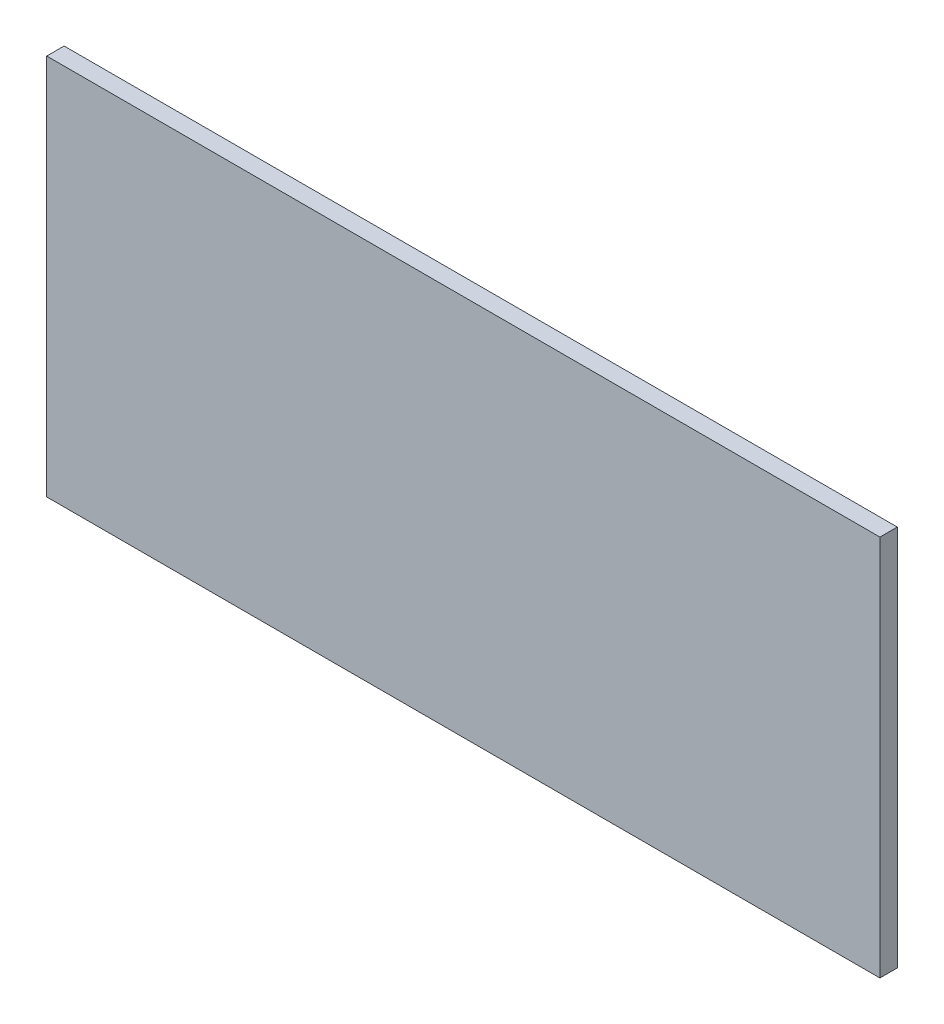
ISO-10303-21;
HEADER;
FILE_DESCRIPTION(('STEP AP214'),'2;1');
FILE_NAME('part.step','',(''),(''),'','','');
FILE_SCHEMA(('AUTOMOTIVE_DESIGN { 1 0 10303 214 1 1 1 1 }'));
ENDSEC;
DATA;
#1=APPLICATION_CONTEXT('core data for automotive mechanical design processes');
#2=APPLICATION_PROTOCOL_DEFINITION('international standard','automotive_design',2000,#1);
#3=PRODUCT_CONTEXT('',#1,'mechanical');
#4=PRODUCT('Part','Part','',(#3));
#5=PRODUCT_RELATED_PRODUCT_CATEGORY('part','',(#4));
#6=PRODUCT_DEFINITION_FORMATION('','',#4);
#7=PRODUCT_DEFINITION_CONTEXT('part definition',#1,'design');
#8=PRODUCT_DEFINITION('design','',#6,#7);
#9=PRODUCT_DEFINITION_SHAPE('','',#8);
#10=(LENGTH_UNIT() NAMED_UNIT(*) SI_UNIT(.MILLI.,.METRE.));
#11=(NAMED_UNIT(*) PLANE_ANGLE_UNIT() SI_UNIT($,.RADIAN.));
#12=(NAMED_UNIT(*) SI_UNIT($,.STERADIAN.) SOLID_ANGLE_UNIT());
#13=UNCERTAINTY_MEASURE_WITH_UNIT(LENGTH_MEASURE(1.E-05),#10,'distance_accuracy_value','');
#14=(GEOMETRIC_REPRESENTATION_CONTEXT(3) GLOBAL_UNCERTAINTY_ASSIGNED_CONTEXT((#13)) GLOBAL_UNIT_ASSIGNED_CONTEXT((#10,
#11,#12)) REPRESENTATION_CONTEXT('',''));
#15=CARTESIAN_POINT('',(0.,0.,0.));
#16=DIRECTION('',(0.,0.,1.));
#17=DIRECTION('',(1.,0.,0.));
#18=AXIS2_PLACEMENT_3D('',#15,#16,#17);
#19=CARTESIAN_POINT('',(0.,0.,6.35));
#20=DIRECTION('',(1.,0.,0.));
#21=DIRECTION('',(0.,0.,-1.));
#22=AXIS2_PLACEMENT_3D('',#19,#20,#21);
#23=PLANE('',#22);
#24=DIRECTION('',(0.,-1.,0.));
#25=VECTOR('',#24,1.);
#26=CARTESIAN_POINT('',(0.,0.,0.));
#27=LINE('',#26,#25);
#28=CARTESIAN_POINT('',(0.,139.7,0.));
#29=VERTEX_POINT('',#28);
#30=CARTESIAN_POINT('',(0.,0.,0.));
#31=VERTEX_POINT('',#30);
#32=EDGE_CURVE('E107',#29,#31,#27,.T.);
#33=ORIENTED_EDGE('',*,*,#32,.T.);
#34=DIRECTION('',(0.,0.,-1.));
#35=VECTOR('',#34,1.);
#36=CARTESIAN_POINT('',(0.,0.,6.35));
#37=LINE('',#36,#35);
#38=CARTESIAN_POINT('',(0.,0.,6.35));
#39=VERTEX_POINT('',#38);
#40=EDGE_CURVE('E11',#39,#31,#37,.T.);
#41=ORIENTED_EDGE('',*,*,#40,.F.);
#42=DIRECTION('',(0.,-1.,0.));
#43=VECTOR('',#42,1.);
#44=CARTESIAN_POINT('',(0.,0.,6.35));
#45=LINE('',#44,#43);
#46=CARTESIAN_POINT('',(0.,139.7,6.35));
#47=VERTEX_POINT('',#46);
#48=EDGE_CURVE('E91',#47,#39,#45,.T.);
#49=ORIENTED_EDGE('',*,*,#48,.F.);
#50=DIRECTION('',(0.,0.,-1.));
#51=VECTOR('',#50,1.);
#52=CARTESIAN_POINT('',(0.,139.7,6.35));
#53=LINE('',#52,#51);
#54=EDGE_CURVE('E103',#47,#29,#53,.T.);
#55=ORIENTED_EDGE('',*,*,#54,.T.);
#56=EDGE_LOOP('',(#33,#41,#49,#55));
#57=FACE_BOUND('',#56,.T.);
#58=ADVANCED_FACE('F39',(#57),#23,.F.);
#59=CARTESIAN_POINT('',(0.,0.,6.35));
#60=DIRECTION('',(0.,1.,0.));
#61=DIRECTION('',(0.,0.,1.));
#62=AXIS2_PLACEMENT_3D('',#59,#60,#61);
#63=PLANE('',#62);
#64=DIRECTION('',(1.,0.,0.));
#65=VECTOR('',#64,1.);
#66=CARTESIAN_POINT('',(0.,0.,0.));
#67=LINE('',#66,#65);
#68=CARTESIAN_POINT('',(304.8,0.,0.));
#69=VERTEX_POINT('',#68);
#70=EDGE_CURVE('E96',#31,#69,#67,.T.);
#71=ORIENTED_EDGE('',*,*,#70,.T.);
#72=DIRECTION('',(0.,0.,-1.));
#73=VECTOR('',#72,1.);
#74=CARTESIAN_POINT('',(304.8,0.,6.35));
#75=LINE('',#74,#73);
#76=CARTESIAN_POINT('',(304.8,0.,6.35));
#77=VERTEX_POINT('',#76);
#78=EDGE_CURVE('E48',#77,#69,#75,.T.);
#79=ORIENTED_EDGE('',*,*,#78,.F.);
#80=DIRECTION('',(1.,0.,0.));
#81=VECTOR('',#80,1.);
#82=CARTESIAN_POINT('',(0.,0.,6.35));
#83=LINE('',#82,#81);
#84=EDGE_CURVE('E86',#39,#77,#83,.T.);
#85=ORIENTED_EDGE('',*,*,#84,.F.);
#86=ORIENTED_EDGE('',*,*,#40,.T.);
#87=EDGE_LOOP('',(#71,#79,#85,#86));
#88=FACE_BOUND('',#87,.T.);
#89=ADVANCED_FACE('F95',(#88),#63,.F.);
#90=CARTESIAN_POINT('',(304.8,0.,6.35));
#91=DIRECTION('',(-1.,0.,0.));
#92=DIRECTION('',(0.,0.,1.));
#93=AXIS2_PLACEMENT_3D('',#90,#91,#92);
#94=PLANE('',#93);
#95=DIRECTION('',(0.,1.,0.));
#96=VECTOR('',#95,1.);
#97=CARTESIAN_POINT('',(304.8,0.,0.));
#98=LINE('',#97,#96);
#99=CARTESIAN_POINT('',(304.8,139.7,0.));
#100=VERTEX_POINT('',#99);
#101=EDGE_CURVE('E73',#69,#100,#98,.T.);
#102=ORIENTED_EDGE('',*,*,#101,.T.);
#103=DIRECTION('',(0.,0.,-1.));
#104=VECTOR('',#103,1.);
#105=CARTESIAN_POINT('',(304.8,139.7,6.35));
#106=LINE('',#105,#104);
#107=CARTESIAN_POINT('',(304.8,139.7,6.35));
#108=VERTEX_POINT('',#107);
#109=EDGE_CURVE('E98',#108,#100,#106,.T.);
#110=ORIENTED_EDGE('',*,*,#109,.F.);
#111=DIRECTION('',(0.,1.,0.));
#112=VECTOR('',#111,1.);
#113=CARTESIAN_POINT('',(304.8,0.,6.35));
#114=LINE('',#113,#112);
#115=EDGE_CURVE('E89',#77,#108,#114,.T.);
#116=ORIENTED_EDGE('',*,*,#115,.F.);
#117=ORIENTED_EDGE('',*,*,#78,.T.);
#118=EDGE_LOOP('',(#102,#110,#116,#117));
#119=FACE_BOUND('',#118,.T.);
#120=ADVANCED_FACE('F99',(#119),#94,.F.);
#121=CARTESIAN_POINT('',(0.,139.7,6.35));
#122=DIRECTION('',(0.,-1.,0.));
#123=DIRECTION('',(0.,0.,-1.));
#124=AXIS2_PLACEMENT_3D('',#121,#122,#123);
#125=PLANE('',#124);
#126=DIRECTION('',(-1.,0.,0.));
#127=VECTOR('',#126,1.);
#128=CARTESIAN_POINT('',(0.,139.7,0.));
#129=LINE('',#128,#127);
#130=EDGE_CURVE('E79',#100,#29,#129,.T.);
#131=ORIENTED_EDGE('',*,*,#130,.T.);
#132=ORIENTED_EDGE('',*,*,#54,.F.);
#133=DIRECTION('',(-1.,0.,0.));
#134=VECTOR('',#133,1.);
#135=CARTESIAN_POINT('',(0.,139.7,6.35));
#136=LINE('',#135,#134);
#137=EDGE_CURVE('E56',#108,#47,#136,.T.);
#138=ORIENTED_EDGE('',*,*,#137,.F.);
#139=ORIENTED_EDGE('',*,*,#109,.T.);
#140=EDGE_LOOP('',(#131,#132,#138,#139));
#141=FACE_BOUND('',#140,.T.);
#142=ADVANCED_FACE('F120',(#141),#125,.F.);
#143=CARTESIAN_POINT('',(0.,0.,6.35));
#144=DIRECTION('',(0.,0.,-1.));
#145=DIRECTION('',(-1.,0.,0.));
#146=AXIS2_PLACEMENT_3D('',#143,#144,#145);
#147=PLANE('',#146);
#148=ORIENTED_EDGE('',*,*,#48,.T.);
#149=ORIENTED_EDGE('',*,*,#84,.T.);
#150=ORIENTED_EDGE('',*,*,#115,.T.);
#151=ORIENTED_EDGE('',*,*,#137,.T.);
#152=EDGE_LOOP('',(#148,#149,#150,#151));
#153=FACE_BOUND('',#152,.T.);
#154=ADVANCED_FACE('F87',(#153),#147,.F.);
#155=CARTESIAN_POINT('',(0.,0.,0.));
#156=DIRECTION('',(0.,0.,-1.));
#157=DIRECTION('',(-1.,0.,0.));
#158=AXIS2_PLACEMENT_3D('',#155,#156,#157);
#159=PLANE('',#158);
#160=ORIENTED_EDGE('',*,*,#32,.F.);
#161=ORIENTED_EDGE('',*,*,#130,.F.);
#162=ORIENTED_EDGE('',*,*,#101,.F.);
#163=ORIENTED_EDGE('',*,*,#70,.F.);
#164=EDGE_LOOP('',(#160,#161,#162,#163));
#165=FACE_BOUND('',#164,.T.);
#166=ADVANCED_FACE('F123',(#165),#159,.T.);
#167=CLOSED_SHELL('',(#58,#89,#120,#142,#154,#166));
#168=MANIFOLD_SOLID_BREP('B2',#167);
#169=ADVANCED_BREP_SHAPE_REPRESENTATION('',(#18,#168),#14);
#170=SHAPE_DEFINITION_REPRESENTATION(#9,#169);
ENDSEC;
END-ISO-10303-21;
